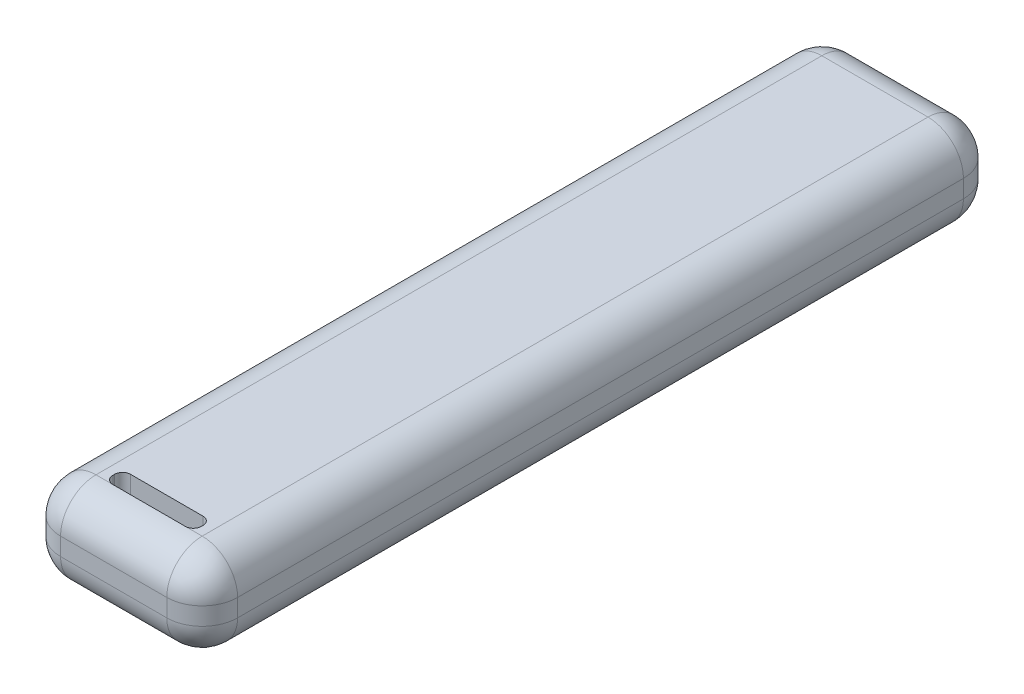
ISO-10303-21;
HEADER;
FILE_DESCRIPTION(('STEP AP214'),'2;1');
FILE_NAME('part.step','',(''),(''),'','','');
FILE_SCHEMA(('AUTOMOTIVE_DESIGN { 1 0 10303 214 1 1 1 1 }'));
ENDSEC;
DATA;
#1=APPLICATION_CONTEXT('core data for automotive mechanical design processes');
#2=APPLICATION_PROTOCOL_DEFINITION('international standard','automotive_design',2000,#1);
#3=PRODUCT_CONTEXT('',#1,'mechanical');
#4=PRODUCT('Part','Part','',(#3));
#5=PRODUCT_RELATED_PRODUCT_CATEGORY('part','',(#4));
#6=PRODUCT_DEFINITION_FORMATION('','',#4);
#7=PRODUCT_DEFINITION_CONTEXT('part definition',#1,'design');
#8=PRODUCT_DEFINITION('design','',#6,#7);
#9=PRODUCT_DEFINITION_SHAPE('','',#8);
#10=(LENGTH_UNIT() NAMED_UNIT(*) SI_UNIT(.MILLI.,.METRE.));
#11=(NAMED_UNIT(*) PLANE_ANGLE_UNIT() SI_UNIT($,.RADIAN.));
#12=(NAMED_UNIT(*) SI_UNIT($,.STERADIAN.) SOLID_ANGLE_UNIT());
#13=UNCERTAINTY_MEASURE_WITH_UNIT(LENGTH_MEASURE(1.E-05),#10,'distance_accuracy_value','');
#14=(GEOMETRIC_REPRESENTATION_CONTEXT(3) GLOBAL_UNCERTAINTY_ASSIGNED_CONTEXT((#13)) GLOBAL_UNIT_ASSIGNED_CONTEXT((#10,
#11,#12)) REPRESENTATION_CONTEXT('',''));
#15=CARTESIAN_POINT('',(0.,0.,0.));
#16=DIRECTION('',(0.,0.,1.));
#17=DIRECTION('',(1.,0.,0.));
#18=AXIS2_PLACEMENT_3D('',#15,#16,#17);
#19=CARTESIAN_POINT('',(5.,2.5,45.));
#20=DIRECTION('',(-1.,0.,0.));
#21=DIRECTION('',(0.,0.,1.));
#22=AXIS2_PLACEMENT_3D('',#19,#20,#21);
#23=PLANE('',#22);
#24=DIRECTION('',(0.,1.,0.));
#25=VECTOR('',#24,1.);
#26=CARTESIAN_POINT('',(5.,-2.5,43.));
#27=LINE('',#26,#25);
#28=CARTESIAN_POINT('',(5.,0.499999999999999,43.));
#29=VERTEX_POINT('',#28);
#30=CARTESIAN_POINT('',(5.,-0.499999999999999,43.));
#31=VERTEX_POINT('',#30);
#32=EDGE_CURVE('E244',#29,#31,#27,.F.);
#33=ORIENTED_EDGE('',*,*,#32,.T.);
#34=DIRECTION('',(0.,0.,-1.));
#35=VECTOR('',#34,1.);
#36=CARTESIAN_POINT('',(5.,-0.499999999999999,45.));
#37=LINE('',#36,#35);
#38=CARTESIAN_POINT('',(5.,-0.499999999999999,2.));
#39=VERTEX_POINT('',#38);
#40=EDGE_CURVE('E249',#31,#39,#37,.T.);
#41=ORIENTED_EDGE('',*,*,#40,.T.);
#42=DIRECTION('',(0.,1.,0.));
#43=VECTOR('',#42,1.);
#44=CARTESIAN_POINT('',(5.,2.5,2.));
#45=LINE('',#44,#43);
#46=CARTESIAN_POINT('',(5.,0.499999999999999,2.));
#47=VERTEX_POINT('',#46);
#48=EDGE_CURVE('E246',#39,#47,#45,.T.);
#49=ORIENTED_EDGE('',*,*,#48,.T.);
#50=DIRECTION('',(0.,0.,-1.));
#51=VECTOR('',#50,1.);
#52=CARTESIAN_POINT('',(5.,0.499999999999999,45.));
#53=LINE('',#52,#51);
#54=EDGE_CURVE('E242',#47,#29,#53,.F.);
#55=ORIENTED_EDGE('',*,*,#54,.T.);
#56=EDGE_LOOP('',(#33,#41,#49,#55));
#57=FACE_BOUND('',#56,.T.);
#58=ADVANCED_FACE('F32',(#57),#23,.F.);
#59=CARTESIAN_POINT('',(-5.,2.5,45.));
#60=DIRECTION('',(0.,-1.,0.));
#61=DIRECTION('',(0.,0.,-1.));
#62=AXIS2_PLACEMENT_3D('',#59,#60,#61);
#63=PLANE('',#62);
#64=DIRECTION('',(-1.,0.,0.));
#65=VECTOR('',#64,1.);
#66=CARTESIAN_POINT('',(5.,2.5,43.));
#67=LINE('',#66,#65);
#68=CARTESIAN_POINT('',(-3.,2.5,43.));
#69=VERTEX_POINT('',#68);
#70=CARTESIAN_POINT('',(-2.05,2.5,43.));
#71=VERTEX_POINT('',#70);
#72=EDGE_CURVE('E283',#69,#71,#67,.F.);
#73=ORIENTED_EDGE('',*,*,#72,.T.);
#74=CARTESIAN_POINT('',(-2.05,2.5,42.55));
#75=DIRECTION('',(0.,-1.,0.));
#76=DIRECTION('',(0.,0.,-1.));
#77=AXIS2_PLACEMENT_3D('',#74,#75,#76);
#78=CIRCLE('',#77,0.449999999999999);
#79=CARTESIAN_POINT('',(-2.5,2.5,42.55));
#80=VERTEX_POINT('',#79);
#81=EDGE_CURVE('E226',#71,#80,#78,.T.);
#82=ORIENTED_EDGE('',*,*,#81,.T.);
#83=DIRECTION('',(0.,0.,-1.));
#84=VECTOR('',#83,1.);
#85=CARTESIAN_POINT('',(-2.5,2.5,45.));
#86=LINE('',#85,#84);
#87=CARTESIAN_POINT('',(-2.5,2.5,42.45));
#88=VERTEX_POINT('',#87);
#89=EDGE_CURVE('E236',#80,#88,#86,.T.);
#90=ORIENTED_EDGE('',*,*,#89,.T.);
#91=CARTESIAN_POINT('',(-2.05,2.5,42.45));
#92=DIRECTION('',(0.,-1.,0.));
#93=DIRECTION('',(0.,0.,-1.));
#94=AXIS2_PLACEMENT_3D('',#91,#92,#93);
#95=CIRCLE('',#94,0.449999999999999);
#96=CARTESIAN_POINT('',(-2.05,2.5,42.));
#97=VERTEX_POINT('',#96);
#98=EDGE_CURVE('E239',#88,#97,#95,.T.);
#99=ORIENTED_EDGE('',*,*,#98,.T.);
#100=DIRECTION('',(1.,0.,0.));
#101=VECTOR('',#100,1.);
#102=CARTESIAN_POINT('',(-5.,2.5,42.));
#103=LINE('',#102,#101);
#104=CARTESIAN_POINT('',(2.05,2.5,42.));
#105=VERTEX_POINT('',#104);
#106=EDGE_CURVE('E180',#97,#105,#103,.T.);
#107=ORIENTED_EDGE('',*,*,#106,.T.);
#108=CARTESIAN_POINT('',(2.05,2.5,42.45));
#109=DIRECTION('',(0.,-1.,0.));
#110=DIRECTION('',(0.,0.,-1.));
#111=AXIS2_PLACEMENT_3D('',#108,#109,#110);
#112=CIRCLE('',#111,0.449999999999999);
#113=CARTESIAN_POINT('',(2.5,2.5,42.45));
#114=VERTEX_POINT('',#113);
#115=EDGE_CURVE('E230',#105,#114,#112,.T.);
#116=ORIENTED_EDGE('',*,*,#115,.T.);
#117=DIRECTION('',(0.,0.,1.));
#118=VECTOR('',#117,1.);
#119=CARTESIAN_POINT('',(2.5,2.5,45.));
#120=LINE('',#119,#118);
#121=CARTESIAN_POINT('',(2.5,2.5,42.55));
#122=VERTEX_POINT('',#121);
#123=EDGE_CURVE('E233',#114,#122,#120,.T.);
#124=ORIENTED_EDGE('',*,*,#123,.T.);
#125=CARTESIAN_POINT('',(2.05,2.5,42.55));
#126=DIRECTION('',(0.,-1.,0.));
#127=DIRECTION('',(0.,0.,-1.));
#128=AXIS2_PLACEMENT_3D('',#125,#126,#127);
#129=CIRCLE('',#128,0.449999999999999);
#130=CARTESIAN_POINT('',(2.05,2.5,43.));
#131=VERTEX_POINT('',#130);
#132=EDGE_CURVE('E213',#122,#131,#129,.T.);
#133=ORIENTED_EDGE('',*,*,#132,.T.);
#134=CARTESIAN_POINT('',(3.,2.5,43.));
#135=VERTEX_POINT('',#134);
#136=EDGE_CURVE('E282',#131,#135,#67,.F.);
#137=ORIENTED_EDGE('',*,*,#136,.T.);
#138=DIRECTION('',(0.,0.,-1.));
#139=VECTOR('',#138,1.);
#140=CARTESIAN_POINT('',(3.,2.5,45.));
#141=LINE('',#140,#139);
#142=CARTESIAN_POINT('',(3.,2.5,2.));
#143=VERTEX_POINT('',#142);
#144=EDGE_CURVE('E280',#135,#143,#141,.T.);
#145=ORIENTED_EDGE('',*,*,#144,.T.);
#146=DIRECTION('',(-1.,0.,0.));
#147=VECTOR('',#146,1.);
#148=CARTESIAN_POINT('',(-5.,2.5,2.));
#149=LINE('',#148,#147);
#150=CARTESIAN_POINT('',(-3.,2.5,2.));
#151=VERTEX_POINT('',#150);
#152=EDGE_CURVE('E286',#143,#151,#149,.T.);
#153=ORIENTED_EDGE('',*,*,#152,.T.);
#154=DIRECTION('',(0.,0.,-1.));
#155=VECTOR('',#154,1.);
#156=CARTESIAN_POINT('',(-3.,2.5,45.));
#157=LINE('',#156,#155);
#158=EDGE_CURVE('E290',#151,#69,#157,.F.);
#159=ORIENTED_EDGE('',*,*,#158,.T.);
#160=EDGE_LOOP('',(#73,#82,#90,#99,#107,#116,#124,#133,#137,#145,#153,#159));
#161=FACE_BOUND('',#160,.T.);
#162=ADVANCED_FACE('F443',(#161),#63,.F.);
#163=CARTESIAN_POINT('',(-5.,2.5,45.));
#164=DIRECTION('',(1.,0.,0.));
#165=DIRECTION('',(0.,0.,-1.));
#166=AXIS2_PLACEMENT_3D('',#163,#164,#165);
#167=PLANE('',#166);
#168=DIRECTION('',(0.,-1.,0.));
#169=VECTOR('',#168,1.);
#170=CARTESIAN_POINT('',(-5.,2.5,43.));
#171=LINE('',#170,#169);
#172=CARTESIAN_POINT('',(-5.,-0.499999999999999,43.));
#173=VERTEX_POINT('',#172);
#174=CARTESIAN_POINT('',(-5.,0.5,43.));
#175=VERTEX_POINT('',#174);
#176=EDGE_CURVE('E273',#173,#175,#171,.F.);
#177=ORIENTED_EDGE('',*,*,#176,.T.);
#178=DIRECTION('',(0.,0.,-1.));
#179=VECTOR('',#178,1.);
#180=CARTESIAN_POINT('',(-5.,0.5,45.));
#181=LINE('',#180,#179);
#182=CARTESIAN_POINT('',(-5.,0.5,2.));
#183=VERTEX_POINT('',#182);
#184=EDGE_CURVE('E278',#175,#183,#181,.T.);
#185=ORIENTED_EDGE('',*,*,#184,.T.);
#186=DIRECTION('',(0.,-1.,0.));
#187=VECTOR('',#186,1.);
#188=CARTESIAN_POINT('',(-5.,2.5,2.));
#189=LINE('',#188,#187);
#190=CARTESIAN_POINT('',(-5.,-0.499999999999999,2.));
#191=VERTEX_POINT('',#190);
#192=EDGE_CURVE('E275',#183,#191,#189,.T.);
#193=ORIENTED_EDGE('',*,*,#192,.T.);
#194=DIRECTION('',(0.,0.,-1.));
#195=VECTOR('',#194,1.);
#196=CARTESIAN_POINT('',(-5.,-0.499999999999999,45.));
#197=LINE('',#196,#195);
#198=EDGE_CURVE('E271',#191,#173,#197,.F.);
#199=ORIENTED_EDGE('',*,*,#198,.T.);
#200=EDGE_LOOP('',(#177,#185,#193,#199));
#201=FACE_BOUND('',#200,.T.);
#202=ADVANCED_FACE('F413',(#201),#167,.F.);
#203=CARTESIAN_POINT('',(-5.,-2.5,45.));
#204=DIRECTION('',(0.,1.,0.));
#205=DIRECTION('',(0.,0.,1.));
#206=AXIS2_PLACEMENT_3D('',#203,#204,#205);
#207=PLANE('',#206);
#208=DIRECTION('',(0.,0.,-1.));
#209=VECTOR('',#208,1.);
#210=CARTESIAN_POINT('',(-2.5,-2.5,42.45));
#211=LINE('',#210,#209);
#212=CARTESIAN_POINT('',(-2.5,-2.5,42.55));
#213=VERTEX_POINT('',#212);
#214=CARTESIAN_POINT('',(-2.5,-2.5,42.45));
#215=VERTEX_POINT('',#214);
#216=EDGE_CURVE('E184',#213,#215,#211,.T.);
#217=ORIENTED_EDGE('',*,*,#216,.F.);
#218=CARTESIAN_POINT('',(-2.05,-2.5,42.55));
#219=DIRECTION('',(0.,-1.,0.));
#220=DIRECTION('',(0.,0.,-1.));
#221=AXIS2_PLACEMENT_3D('',#218,#219,#220);
#222=CIRCLE('',#221,0.449999999999999);
#223=CARTESIAN_POINT('',(-2.05,-2.5,43.));
#224=VERTEX_POINT('',#223);
#225=EDGE_CURVE('E208',#224,#213,#222,.T.);
#226=ORIENTED_EDGE('',*,*,#225,.F.);
#227=DIRECTION('',(1.,0.,0.));
#228=VECTOR('',#227,1.);
#229=CARTESIAN_POINT('',(-5.,-2.5,43.));
#230=LINE('',#229,#228);
#231=CARTESIAN_POINT('',(-3.,-2.5,43.));
#232=VERTEX_POINT('',#231);
#233=EDGE_CURVE('E262',#224,#232,#230,.F.);
#234=ORIENTED_EDGE('',*,*,#233,.T.);
#235=DIRECTION('',(0.,0.,-1.));
#236=VECTOR('',#235,1.);
#237=CARTESIAN_POINT('',(-3.,-2.5,45.));
#238=LINE('',#237,#236);
#239=CARTESIAN_POINT('',(-3.,-2.5,2.));
#240=VERTEX_POINT('',#239);
#241=EDGE_CURVE('E269',#232,#240,#238,.T.);
#242=ORIENTED_EDGE('',*,*,#241,.T.);
#243=DIRECTION('',(1.,0.,0.));
#244=VECTOR('',#243,1.);
#245=CARTESIAN_POINT('',(-5.,-2.5,2.));
#246=LINE('',#245,#244);
#247=CARTESIAN_POINT('',(3.,-2.5,2.));
#248=VERTEX_POINT('',#247);
#249=EDGE_CURVE('E266',#240,#248,#246,.T.);
#250=ORIENTED_EDGE('',*,*,#249,.T.);
#251=DIRECTION('',(0.,0.,-1.));
#252=VECTOR('',#251,1.);
#253=CARTESIAN_POINT('',(3.,-2.5,45.));
#254=LINE('',#253,#252);
#255=CARTESIAN_POINT('',(3.,-2.5,43.));
#256=VERTEX_POINT('',#255);
#257=EDGE_CURVE('E260',#248,#256,#254,.F.);
#258=ORIENTED_EDGE('',*,*,#257,.T.);
#259=CARTESIAN_POINT('',(2.05,-2.5,43.));
#260=VERTEX_POINT('',#259);
#261=EDGE_CURVE('E263',#256,#260,#230,.F.);
#262=ORIENTED_EDGE('',*,*,#261,.T.);
#263=CARTESIAN_POINT('',(2.05,-2.5,42.55));
#264=DIRECTION('',(0.,-1.,0.));
#265=DIRECTION('',(0.,0.,-1.));
#266=AXIS2_PLACEMENT_3D('',#263,#264,#265);
#267=CIRCLE('',#266,0.449999999999999);
#268=CARTESIAN_POINT('',(2.5,-2.5,42.55));
#269=VERTEX_POINT('',#268);
#270=EDGE_CURVE('E49',#269,#260,#267,.T.);
#271=ORIENTED_EDGE('',*,*,#270,.F.);
#272=DIRECTION('',(0.,0.,1.));
#273=VECTOR('',#272,1.);
#274=CARTESIAN_POINT('',(2.5,-2.5,42.45));
#275=LINE('',#274,#273);
#276=CARTESIAN_POINT('',(2.5,-2.5,42.45));
#277=VERTEX_POINT('',#276);
#278=EDGE_CURVE('E200',#277,#269,#275,.T.);
#279=ORIENTED_EDGE('',*,*,#278,.F.);
#280=CARTESIAN_POINT('',(2.05,-2.5,42.45));
#281=DIRECTION('',(0.,-1.,0.));
#282=DIRECTION('',(0.,0.,-1.));
#283=AXIS2_PLACEMENT_3D('',#280,#281,#282);
#284=CIRCLE('',#283,0.449999999999999);
#285=CARTESIAN_POINT('',(2.05,-2.5,42.));
#286=VERTEX_POINT('',#285);
#287=EDGE_CURVE('E198',#286,#277,#284,.T.);
#288=ORIENTED_EDGE('',*,*,#287,.F.);
#289=DIRECTION('',(1.,0.,0.));
#290=VECTOR('',#289,1.);
#291=CARTESIAN_POINT('',(2.05,-2.5,42.));
#292=LINE('',#291,#290);
#293=CARTESIAN_POINT('',(-2.05,-2.5,42.));
#294=VERTEX_POINT('',#293);
#295=EDGE_CURVE('E177',#294,#286,#292,.T.);
#296=ORIENTED_EDGE('',*,*,#295,.F.);
#297=CARTESIAN_POINT('',(-2.05,-2.5,42.45));
#298=DIRECTION('',(0.,-1.,0.));
#299=DIRECTION('',(0.,0.,1.));
#300=AXIS2_PLACEMENT_3D('',#297,#298,#299);
#301=CIRCLE('',#300,0.449999999999999);
#302=EDGE_CURVE('E187',#215,#294,#301,.T.);
#303=ORIENTED_EDGE('',*,*,#302,.F.);
#304=EDGE_LOOP('',(#217,#226,#234,#242,#250,#258,#262,#271,#279,#288,#296,#303));
#305=FACE_BOUND('',#304,.T.);
#306=ADVANCED_FACE('F195',(#305),#207,.F.);
#307=CARTESIAN_POINT('',(5.,-2.5,45.));
#308=DIRECTION('',(0.,0.,1.));
#309=DIRECTION('',(1.,0.,0.));
#310=AXIS2_PLACEMENT_3D('',#307,#308,#309);
#311=PLANE('',#310);
#312=DIRECTION('',(0.,1.,0.));
#313=VECTOR('',#312,1.);
#314=CARTESIAN_POINT('',(3.,2.5,45.));
#315=LINE('',#314,#313);
#316=CARTESIAN_POINT('',(3.,-0.499999999999999,45.));
#317=VERTEX_POINT('',#316);
#318=CARTESIAN_POINT('',(3.,0.499999999999999,45.));
#319=VERTEX_POINT('',#318);
#320=EDGE_CURVE('E41',#317,#319,#315,.T.);
#321=ORIENTED_EDGE('',*,*,#320,.T.);
#322=DIRECTION('',(-1.,0.,0.));
#323=VECTOR('',#322,1.);
#324=CARTESIAN_POINT('',(-5.,0.499999999999999,45.));
#325=LINE('',#324,#323);
#326=CARTESIAN_POINT('',(-3.,0.499999999999999,45.));
#327=VERTEX_POINT('',#326);
#328=EDGE_CURVE('E12',#319,#327,#325,.T.);
#329=ORIENTED_EDGE('',*,*,#328,.T.);
#330=DIRECTION('',(0.,-1.,0.));
#331=VECTOR('',#330,1.);
#332=CARTESIAN_POINT('',(-3.,-2.5,45.));
#333=LINE('',#332,#331);
#334=CARTESIAN_POINT('',(-3.,-0.499999999999999,45.));
#335=VERTEX_POINT('',#334);
#336=EDGE_CURVE('E292',#327,#335,#333,.T.);
#337=ORIENTED_EDGE('',*,*,#336,.T.);
#338=DIRECTION('',(1.,0.,0.));
#339=VECTOR('',#338,1.);
#340=CARTESIAN_POINT('',(5.,-0.499999999999999,45.));
#341=LINE('',#340,#339);
#342=EDGE_CURVE('E294',#335,#317,#341,.T.);
#343=ORIENTED_EDGE('',*,*,#342,.T.);
#344=EDGE_LOOP('',(#321,#329,#337,#343));
#345=FACE_BOUND('',#344,.T.);
#346=ADVANCED_FACE('F387',(#345),#311,.T.);
#347=CARTESIAN_POINT('',(5.,-2.5,0.));
#348=DIRECTION('',(0.,0.,1.));
#349=DIRECTION('',(1.,0.,0.));
#350=AXIS2_PLACEMENT_3D('',#347,#348,#349);
#351=PLANE('',#350);
#352=DIRECTION('',(-1.,0.,0.));
#353=VECTOR('',#352,1.);
#354=CARTESIAN_POINT('',(5.,0.499999999999999,0.));
#355=LINE('',#354,#353);
#356=CARTESIAN_POINT('',(-3.,0.499999999999999,0.));
#357=VERTEX_POINT('',#356);
#358=CARTESIAN_POINT('',(3.,0.499999999999999,0.));
#359=VERTEX_POINT('',#358);
#360=EDGE_CURVE('E251',#357,#359,#355,.F.);
#361=ORIENTED_EDGE('',*,*,#360,.T.);
#362=DIRECTION('',(0.,1.,0.));
#363=VECTOR('',#362,1.);
#364=CARTESIAN_POINT('',(3.,-2.5,0.));
#365=LINE('',#364,#363);
#366=CARTESIAN_POINT('',(3.,-0.499999999999999,0.));
#367=VERTEX_POINT('',#366);
#368=EDGE_CURVE('E257',#359,#367,#365,.F.);
#369=ORIENTED_EDGE('',*,*,#368,.T.);
#370=DIRECTION('',(1.,0.,0.));
#371=VECTOR('',#370,1.);
#372=CARTESIAN_POINT('',(5.,-0.499999999999999,0.));
#373=LINE('',#372,#371);
#374=CARTESIAN_POINT('',(-3.,-0.499999999999999,0.));
#375=VERTEX_POINT('',#374);
#376=EDGE_CURVE('E255',#367,#375,#373,.F.);
#377=ORIENTED_EDGE('',*,*,#376,.T.);
#378=DIRECTION('',(0.,-1.,0.));
#379=VECTOR('',#378,1.);
#380=CARTESIAN_POINT('',(-3.,-2.5,0.));
#381=LINE('',#380,#379);
#382=EDGE_CURVE('E253',#375,#357,#381,.F.);
#383=ORIENTED_EDGE('',*,*,#382,.T.);
#384=EDGE_LOOP('',(#361,#369,#377,#383));
#385=FACE_BOUND('',#384,.T.);
#386=ADVANCED_FACE('F525',(#385),#351,.F.);
#387=CARTESIAN_POINT('',(-3.,-2.5,43.));
#388=DIRECTION('',(0.,1.,0.));
#389=DIRECTION('',(0.,0.,1.));
#390=AXIS2_PLACEMENT_3D('',#387,#388,#389);
#391=CYLINDRICAL_SURFACE('',#390,2.);
#392=CARTESIAN_POINT('',(-3.,-0.499999999999999,43.));
#393=DIRECTION('',(0.,-1.,0.));
#394=DIRECTION('',(0.,0.,-1.));
#395=AXIS2_PLACEMENT_3D('',#392,#393,#394);
#396=CIRCLE('',#395,2.);
#397=EDGE_CURVE('E36',#335,#173,#396,.T.);
#398=ORIENTED_EDGE('',*,*,#397,.F.);
#399=ORIENTED_EDGE('',*,*,#336,.F.);
#400=CARTESIAN_POINT('',(-3.,0.5,43.));
#401=DIRECTION('',(0.,1.,0.));
#402=DIRECTION('',(0.,0.,1.));
#403=AXIS2_PLACEMENT_3D('',#400,#401,#402);
#404=CIRCLE('',#403,2.);
#405=EDGE_CURVE('E355',#175,#327,#404,.T.);
#406=ORIENTED_EDGE('',*,*,#405,.F.);
#407=ORIENTED_EDGE('',*,*,#176,.F.);
#408=EDGE_LOOP('',(#398,#399,#406,#407));
#409=FACE_BOUND('',#408,.T.);
#410=ADVANCED_FACE('F34',(#409),#391,.T.);
#411=CARTESIAN_POINT('',(-3.,-0.499999999999999,43.));
#412=DIRECTION('',(0.,0.,1.));
#413=DIRECTION('',(1.,0.,0.));
#414=AXIS2_PLACEMENT_3D('',#411,#412,#413);
#415=SPHERICAL_SURFACE('',#414,2.);
#416=CARTESIAN_POINT('',(-3.,-0.499999999999999,43.));
#417=DIRECTION('',(-1.,0.,0.));
#418=DIRECTION('',(0.,0.,1.));
#419=AXIS2_PLACEMENT_3D('',#416,#417,#418);
#420=CIRCLE('',#419,2.);
#421=EDGE_CURVE('E350',#335,#232,#420,.F.);
#422=ORIENTED_EDGE('',*,*,#421,.F.);
#423=ORIENTED_EDGE('',*,*,#397,.T.);
#424=CARTESIAN_POINT('',(-3.,-0.499999999999999,43.));
#425=DIRECTION('',(0.,0.,1.));
#426=DIRECTION('',(1.,0.,0.));
#427=AXIS2_PLACEMENT_3D('',#424,#425,#426);
#428=CIRCLE('',#427,2.);
#429=EDGE_CURVE('E353',#232,#173,#428,.F.);
#430=ORIENTED_EDGE('',*,*,#429,.F.);
#431=EDGE_LOOP('',(#422,#423,#430));
#432=FACE_BOUND('',#431,.T.);
#433=ADVANCED_FACE('F367',(#432),#415,.T.);
#434=CARTESIAN_POINT('',(-3.,0.499999999999999,43.));
#435=DIRECTION('',(0.,0.,1.));
#436=DIRECTION('',(1.,0.,0.));
#437=AXIS2_PLACEMENT_3D('',#434,#435,#436);
#438=SPHERICAL_SURFACE('',#437,2.);
#439=CARTESIAN_POINT('',(-3.,0.499999999999999,43.));
#440=DIRECTION('',(0.,0.,1.));
#441=DIRECTION('',(1.,0.,0.));
#442=AXIS2_PLACEMENT_3D('',#439,#440,#441);
#443=CIRCLE('',#442,2.);
#444=EDGE_CURVE('E345',#175,#69,#443,.F.);
#445=ORIENTED_EDGE('',*,*,#444,.F.);
#446=ORIENTED_EDGE('',*,*,#405,.T.);
#447=CARTESIAN_POINT('',(-3.,0.499999999999999,43.));
#448=DIRECTION('',(-1.,0.,0.));
#449=DIRECTION('',(0.,-1.,0.));
#450=AXIS2_PLACEMENT_3D('',#447,#448,#449);
#451=CIRCLE('',#450,2.);
#452=EDGE_CURVE('E348',#69,#327,#451,.F.);
#453=ORIENTED_EDGE('',*,*,#452,.F.);
#454=EDGE_LOOP('',(#445,#446,#453));
#455=FACE_BOUND('',#454,.T.);
#456=ADVANCED_FACE('F405',(#455),#438,.T.);
#457=CARTESIAN_POINT('',(-3.,-0.499999999999999,45.));
#458=DIRECTION('',(0.,0.,-1.));
#459=DIRECTION('',(-1.,0.,0.));
#460=AXIS2_PLACEMENT_3D('',#457,#458,#459);
#461=CYLINDRICAL_SURFACE('',#460,2.);
#462=ORIENTED_EDGE('',*,*,#429,.T.);
#463=ORIENTED_EDGE('',*,*,#198,.F.);
#464=CARTESIAN_POINT('',(-3.,-0.499999999999999,2.));
#465=DIRECTION('',(0.,0.,-1.));
#466=DIRECTION('',(-1.,0.,0.));
#467=AXIS2_PLACEMENT_3D('',#464,#465,#466);
#468=CIRCLE('',#467,2.);
#469=EDGE_CURVE('E340',#240,#191,#468,.T.);
#470=ORIENTED_EDGE('',*,*,#469,.F.);
#471=ORIENTED_EDGE('',*,*,#241,.F.);
#472=EDGE_LOOP('',(#462,#463,#470,#471));
#473=FACE_BOUND('',#472,.T.);
#474=ADVANCED_FACE('F374',(#473),#461,.T.);
#475=CARTESIAN_POINT('',(5.,-0.499999999999999,43.));
#476=DIRECTION('',(-1.,0.,0.));
#477=DIRECTION('',(0.,0.,1.));
#478=AXIS2_PLACEMENT_3D('',#475,#476,#477);
#479=CYLINDRICAL_SURFACE('',#478,2.);
#480=ORIENTED_EDGE('',*,*,#421,.T.);
#481=ORIENTED_EDGE('',*,*,#233,.F.);
#482=DIRECTION('',(-1.,0.,0.));
#483=VECTOR('',#482,1.);
#484=CARTESIAN_POINT('',(2.05,-2.5,43.));
#485=LINE('',#484,#483);
#486=EDGE_CURVE('E206',#260,#224,#485,.T.);
#487=ORIENTED_EDGE('',*,*,#486,.F.);
#488=ORIENTED_EDGE('',*,*,#261,.F.);
#489=CARTESIAN_POINT('',(3.,-0.499999999999999,43.));
#490=DIRECTION('',(1.,0.,0.));
#491=DIRECTION('',(0.,0.,-1.));
#492=AXIS2_PLACEMENT_3D('',#489,#490,#491);
#493=CIRCLE('',#492,2.);
#494=EDGE_CURVE('E337',#317,#256,#493,.T.);
#495=ORIENTED_EDGE('',*,*,#494,.F.);
#496=ORIENTED_EDGE('',*,*,#342,.F.);
#497=EDGE_LOOP('',(#480,#481,#487,#488,#495,#496));
#498=FACE_BOUND('',#497,.T.);
#499=ADVANCED_FACE('F382',(#498),#479,.T.);
#500=CARTESIAN_POINT('',(3.,-2.5,43.));
#501=DIRECTION('',(0.,-1.,0.));
#502=DIRECTION('',(0.,0.,-1.));
#503=AXIS2_PLACEMENT_3D('',#500,#501,#502);
#504=CYLINDRICAL_SURFACE('',#503,2.);
#505=CARTESIAN_POINT('',(3.,0.499999999999999,43.));
#506=DIRECTION('',(0.,1.,0.));
#507=DIRECTION('',(0.,0.,1.));
#508=AXIS2_PLACEMENT_3D('',#505,#506,#507);
#509=CIRCLE('',#508,2.);
#510=EDGE_CURVE('E331',#319,#29,#509,.T.);
#511=ORIENTED_EDGE('',*,*,#510,.F.);
#512=ORIENTED_EDGE('',*,*,#320,.F.);
#513=CARTESIAN_POINT('',(3.,-0.499999999999999,43.));
#514=DIRECTION('',(0.,-1.,0.));
#515=DIRECTION('',(0.,0.,-1.));
#516=AXIS2_PLACEMENT_3D('',#513,#514,#515);
#517=CIRCLE('',#516,2.);
#518=EDGE_CURVE('E334',#31,#317,#517,.T.);
#519=ORIENTED_EDGE('',*,*,#518,.F.);
#520=ORIENTED_EDGE('',*,*,#32,.F.);
#521=EDGE_LOOP('',(#511,#512,#519,#520));
#522=FACE_BOUND('',#521,.T.);
#523=ADVANCED_FACE('F392',(#522),#504,.T.);
#524=CARTESIAN_POINT('',(5.,0.499999999999999,43.));
#525=DIRECTION('',(1.,0.,0.));
#526=DIRECTION('',(0.,0.,-1.));
#527=AXIS2_PLACEMENT_3D('',#524,#525,#526);
#528=CYLINDRICAL_SURFACE('',#527,2.);
#529=ORIENTED_EDGE('',*,*,#452,.T.);
#530=ORIENTED_EDGE('',*,*,#328,.F.);
#531=CARTESIAN_POINT('',(3.,0.499999999999999,43.));
#532=DIRECTION('',(1.,0.,0.));
#533=DIRECTION('',(0.,0.,-1.));
#534=AXIS2_PLACEMENT_3D('',#531,#532,#533);
#535=CIRCLE('',#534,2.);
#536=EDGE_CURVE('E328',#135,#319,#535,.T.);
#537=ORIENTED_EDGE('',*,*,#536,.F.);
#538=ORIENTED_EDGE('',*,*,#136,.F.);
#539=EDGE_CURVE('E287',#71,#131,#67,.F.);
#540=ORIENTED_EDGE('',*,*,#539,.F.);
#541=ORIENTED_EDGE('',*,*,#72,.F.);
#542=EDGE_LOOP('',(#529,#530,#537,#538,#540,#541));
#543=FACE_BOUND('',#542,.T.);
#544=ADVANCED_FACE('F402',(#543),#528,.T.);
#545=CARTESIAN_POINT('',(-3.,0.5,45.));
#546=DIRECTION('',(0.,0.,-1.));
#547=DIRECTION('',(-1.,0.,0.));
#548=AXIS2_PLACEMENT_3D('',#545,#546,#547);
#549=CYLINDRICAL_SURFACE('',#548,2.);
#550=ORIENTED_EDGE('',*,*,#444,.T.);
#551=ORIENTED_EDGE('',*,*,#158,.F.);
#552=CARTESIAN_POINT('',(-3.,0.5,2.));
#553=DIRECTION('',(0.,0.,-1.));
#554=DIRECTION('',(-1.,0.,0.));
#555=AXIS2_PLACEMENT_3D('',#552,#553,#554);
#556=CIRCLE('',#555,2.);
#557=EDGE_CURVE('E325',#183,#151,#556,.T.);
#558=ORIENTED_EDGE('',*,*,#557,.F.);
#559=ORIENTED_EDGE('',*,*,#184,.F.);
#560=EDGE_LOOP('',(#550,#551,#558,#559));
#561=FACE_BOUND('',#560,.T.);
#562=ADVANCED_FACE('F410',(#561),#549,.T.);
#563=CARTESIAN_POINT('',(-3.,2.5,2.));
#564=DIRECTION('',(0.,-1.,0.));
#565=DIRECTION('',(0.,0.,-1.));
#566=AXIS2_PLACEMENT_3D('',#563,#564,#565);
#567=CYLINDRICAL_SURFACE('',#566,2.);
#568=CARTESIAN_POINT('',(-3.,-0.499999999999999,2.));
#569=DIRECTION('',(0.,-1.,0.));
#570=DIRECTION('',(0.,0.,-1.));
#571=AXIS2_PLACEMENT_3D('',#568,#569,#570);
#572=CIRCLE('',#571,2.);
#573=EDGE_CURVE('E342',#191,#375,#572,.T.);
#574=ORIENTED_EDGE('',*,*,#573,.F.);
#575=ORIENTED_EDGE('',*,*,#192,.F.);
#576=CARTESIAN_POINT('',(-3.,0.499999999999999,2.));
#577=DIRECTION('',(0.,1.,0.));
#578=DIRECTION('',(-1.,0.,0.));
#579=AXIS2_PLACEMENT_3D('',#576,#577,#578);
#580=CIRCLE('',#579,2.);
#581=EDGE_CURVE('E322',#357,#183,#580,.T.);
#582=ORIENTED_EDGE('',*,*,#581,.F.);
#583=ORIENTED_EDGE('',*,*,#382,.F.);
#584=EDGE_LOOP('',(#574,#575,#582,#583));
#585=FACE_BOUND('',#584,.T.);
#586=ADVANCED_FACE('F417',(#585),#567,.T.);
#587=CARTESIAN_POINT('',(-3.,-0.499999999999999,2.));
#588=DIRECTION('',(0.,0.,1.));
#589=DIRECTION('',(1.,0.,0.));
#590=AXIS2_PLACEMENT_3D('',#587,#588,#589);
#591=SPHERICAL_SURFACE('',#590,2.);
#592=ORIENTED_EDGE('',*,*,#469,.T.);
#593=ORIENTED_EDGE('',*,*,#573,.T.);
#594=CARTESIAN_POINT('',(-3.,-0.499999999999999,2.));
#595=DIRECTION('',(-1.,0.,0.));
#596=DIRECTION('',(0.,-1.,0.));
#597=AXIS2_PLACEMENT_3D('',#594,#595,#596);
#598=CIRCLE('',#597,2.);
#599=EDGE_CURVE('E319',#240,#375,#598,.F.);
#600=ORIENTED_EDGE('',*,*,#599,.F.);
#601=EDGE_LOOP('',(#592,#593,#600));
#602=FACE_BOUND('',#601,.T.);
#603=ADVANCED_FACE('F421',(#602),#591,.T.);
#604=CARTESIAN_POINT('',(3.,-0.499999999999999,43.));
#605=DIRECTION('',(0.,0.,1.));
#606=DIRECTION('',(1.,0.,0.));
#607=AXIS2_PLACEMENT_3D('',#604,#605,#606);
#608=SPHERICAL_SURFACE('',#607,2.);
#609=ORIENTED_EDGE('',*,*,#518,.T.);
#610=ORIENTED_EDGE('',*,*,#494,.T.);
#611=CARTESIAN_POINT('',(3.,-0.499999999999999,43.));
#612=DIRECTION('',(0.,0.,1.));
#613=DIRECTION('',(1.,0.,0.));
#614=AXIS2_PLACEMENT_3D('',#611,#612,#613);
#615=CIRCLE('',#614,2.);
#616=EDGE_CURVE('E316',#31,#256,#615,.F.);
#617=ORIENTED_EDGE('',*,*,#616,.F.);
#618=EDGE_LOOP('',(#609,#610,#617));
#619=FACE_BOUND('',#618,.T.);
#620=ADVANCED_FACE('F434',(#619),#608,.T.);
#621=CARTESIAN_POINT('',(3.,0.499999999999999,43.));
#622=DIRECTION('',(0.,0.,1.));
#623=DIRECTION('',(1.,0.,0.));
#624=AXIS2_PLACEMENT_3D('',#621,#622,#623);
#625=SPHERICAL_SURFACE('',#624,2.);
#626=ORIENTED_EDGE('',*,*,#536,.T.);
#627=ORIENTED_EDGE('',*,*,#510,.T.);
#628=CARTESIAN_POINT('',(3.,0.499999999999999,43.));
#629=DIRECTION('',(0.,0.,1.));
#630=DIRECTION('',(1.,0.,0.));
#631=AXIS2_PLACEMENT_3D('',#628,#629,#630);
#632=CIRCLE('',#631,2.);
#633=EDGE_CURVE('E313',#135,#29,#632,.F.);
#634=ORIENTED_EDGE('',*,*,#633,.F.);
#635=EDGE_LOOP('',(#626,#627,#634));
#636=FACE_BOUND('',#635,.T.);
#637=ADVANCED_FACE('F398',(#636),#625,.T.);
#638=CARTESIAN_POINT('',(-3.,0.499999999999999,2.));
#639=DIRECTION('',(0.,0.,1.));
#640=DIRECTION('',(1.,0.,0.));
#641=AXIS2_PLACEMENT_3D('',#638,#639,#640);
#642=SPHERICAL_SURFACE('',#641,2.);
#643=ORIENTED_EDGE('',*,*,#581,.T.);
#644=ORIENTED_EDGE('',*,*,#557,.T.);
#645=CARTESIAN_POINT('',(-3.,0.499999999999999,2.));
#646=DIRECTION('',(-1.,0.,0.));
#647=DIRECTION('',(0.,0.,1.));
#648=AXIS2_PLACEMENT_3D('',#645,#646,#647);
#649=CIRCLE('',#648,2.);
#650=EDGE_CURVE('E311',#357,#151,#649,.F.);
#651=ORIENTED_EDGE('',*,*,#650,.F.);
#652=EDGE_LOOP('',(#643,#644,#651));
#653=FACE_BOUND('',#652,.T.);
#654=ADVANCED_FACE('F450',(#653),#642,.T.);
#655=CARTESIAN_POINT('',(-5.,-0.499999999999999,2.));
#656=DIRECTION('',(1.,0.,0.));
#657=DIRECTION('',(0.,0.,-1.));
#658=AXIS2_PLACEMENT_3D('',#655,#656,#657);
#659=CYLINDRICAL_SURFACE('',#658,2.);
#660=ORIENTED_EDGE('',*,*,#599,.T.);
#661=ORIENTED_EDGE('',*,*,#376,.F.);
#662=CARTESIAN_POINT('',(3.,-0.499999999999999,2.));
#663=DIRECTION('',(1.,0.,0.));
#664=DIRECTION('',(0.,0.,-1.));
#665=AXIS2_PLACEMENT_3D('',#662,#663,#664);
#666=CIRCLE('',#665,2.);
#667=EDGE_CURVE('E308',#248,#367,#666,.T.);
#668=ORIENTED_EDGE('',*,*,#667,.F.);
#669=ORIENTED_EDGE('',*,*,#249,.F.);
#670=EDGE_LOOP('',(#660,#661,#668,#669));
#671=FACE_BOUND('',#670,.T.);
#672=ADVANCED_FACE('F424',(#671),#659,.T.);
#673=CARTESIAN_POINT('',(3.,-0.499999999999999,45.));
#674=DIRECTION('',(0.,0.,-1.));
#675=DIRECTION('',(-1.,0.,0.));
#676=AXIS2_PLACEMENT_3D('',#673,#674,#675);
#677=CYLINDRICAL_SURFACE('',#676,2.);
#678=ORIENTED_EDGE('',*,*,#616,.T.);
#679=ORIENTED_EDGE('',*,*,#257,.F.);
#680=CARTESIAN_POINT('',(3.,-0.499999999999999,2.));
#681=DIRECTION('',(0.,0.,-1.));
#682=DIRECTION('',(-1.,0.,0.));
#683=AXIS2_PLACEMENT_3D('',#680,#681,#682);
#684=CIRCLE('',#683,2.);
#685=EDGE_CURVE('E306',#39,#248,#684,.T.);
#686=ORIENTED_EDGE('',*,*,#685,.F.);
#687=ORIENTED_EDGE('',*,*,#40,.F.);
#688=EDGE_LOOP('',(#678,#679,#686,#687));
#689=FACE_BOUND('',#688,.T.);
#690=ADVANCED_FACE('F431',(#689),#677,.T.);
#691=CARTESIAN_POINT('',(3.,0.499999999999999,45.));
#692=DIRECTION('',(0.,0.,-1.));
#693=DIRECTION('',(-1.,0.,0.));
#694=AXIS2_PLACEMENT_3D('',#691,#692,#693);
#695=CYLINDRICAL_SURFACE('',#694,2.);
#696=ORIENTED_EDGE('',*,*,#633,.T.);
#697=ORIENTED_EDGE('',*,*,#54,.F.);
#698=CARTESIAN_POINT('',(3.,0.499999999999999,2.));
#699=DIRECTION('',(0.,0.,-1.));
#700=DIRECTION('',(-1.,0.,0.));
#701=AXIS2_PLACEMENT_3D('',#698,#699,#700);
#702=CIRCLE('',#701,2.);
#703=EDGE_CURVE('E303',#143,#47,#702,.T.);
#704=ORIENTED_EDGE('',*,*,#703,.F.);
#705=ORIENTED_EDGE('',*,*,#144,.F.);
#706=EDGE_LOOP('',(#696,#697,#704,#705));
#707=FACE_BOUND('',#706,.T.);
#708=ADVANCED_FACE('F440',(#707),#695,.T.);
#709=CARTESIAN_POINT('',(-5.,0.499999999999999,2.));
#710=DIRECTION('',(-1.,0.,0.));
#711=DIRECTION('',(0.,0.,1.));
#712=AXIS2_PLACEMENT_3D('',#709,#710,#711);
#713=CYLINDRICAL_SURFACE('',#712,2.);
#714=ORIENTED_EDGE('',*,*,#650,.T.);
#715=ORIENTED_EDGE('',*,*,#152,.F.);
#716=CARTESIAN_POINT('',(3.,0.499999999999999,2.));
#717=DIRECTION('',(1.,0.,0.));
#718=DIRECTION('',(0.,1.,0.));
#719=AXIS2_PLACEMENT_3D('',#716,#717,#718);
#720=CIRCLE('',#719,2.);
#721=EDGE_CURVE('E300',#359,#143,#720,.T.);
#722=ORIENTED_EDGE('',*,*,#721,.F.);
#723=ORIENTED_EDGE('',*,*,#360,.F.);
#724=EDGE_LOOP('',(#714,#715,#722,#723));
#725=FACE_BOUND('',#724,.T.);
#726=ADVANCED_FACE('F446',(#725),#713,.T.);
#727=CARTESIAN_POINT('',(3.,-0.499999999999999,2.));
#728=DIRECTION('',(0.,0.,1.));
#729=DIRECTION('',(1.,0.,0.));
#730=AXIS2_PLACEMENT_3D('',#727,#728,#729);
#731=SPHERICAL_SURFACE('',#730,2.);
#732=ORIENTED_EDGE('',*,*,#685,.T.);
#733=ORIENTED_EDGE('',*,*,#667,.T.);
#734=CARTESIAN_POINT('',(3.,-0.499999999999999,2.));
#735=DIRECTION('',(0.,-1.,0.));
#736=DIRECTION('',(0.,0.,-1.));
#737=AXIS2_PLACEMENT_3D('',#734,#735,#736);
#738=CIRCLE('',#737,2.);
#739=EDGE_CURVE('E298',#39,#367,#738,.F.);
#740=ORIENTED_EDGE('',*,*,#739,.F.);
#741=EDGE_LOOP('',(#732,#733,#740));
#742=FACE_BOUND('',#741,.T.);
#743=ADVANCED_FACE('F488',(#742),#731,.T.);
#744=CARTESIAN_POINT('',(3.,0.499999999999999,2.));
#745=DIRECTION('',(0.,0.,1.));
#746=DIRECTION('',(1.,0.,0.));
#747=AXIS2_PLACEMENT_3D('',#744,#745,#746);
#748=SPHERICAL_SURFACE('',#747,2.);
#749=ORIENTED_EDGE('',*,*,#721,.T.);
#750=ORIENTED_EDGE('',*,*,#703,.T.);
#751=CARTESIAN_POINT('',(3.,0.499999999999999,2.));
#752=DIRECTION('',(0.,1.,0.));
#753=DIRECTION('',(0.,0.,1.));
#754=AXIS2_PLACEMENT_3D('',#751,#752,#753);
#755=CIRCLE('',#754,2.);
#756=EDGE_CURVE('E241',#359,#47,#755,.F.);
#757=ORIENTED_EDGE('',*,*,#756,.F.);
#758=EDGE_LOOP('',(#749,#750,#757));
#759=FACE_BOUND('',#758,.T.);
#760=ADVANCED_FACE('F484',(#759),#748,.T.);
#761=CARTESIAN_POINT('',(3.,2.5,2.));
#762=DIRECTION('',(0.,1.,0.));
#763=DIRECTION('',(0.,0.,1.));
#764=AXIS2_PLACEMENT_3D('',#761,#762,#763);
#765=CYLINDRICAL_SURFACE('',#764,2.);
#766=ORIENTED_EDGE('',*,*,#739,.T.);
#767=ORIENTED_EDGE('',*,*,#368,.F.);
#768=ORIENTED_EDGE('',*,*,#756,.T.);
#769=ORIENTED_EDGE('',*,*,#48,.F.);
#770=EDGE_LOOP('',(#766,#767,#768,#769));
#771=FACE_BOUND('',#770,.T.);
#772=ADVANCED_FACE('F471',(#771),#765,.T.);
#773=CARTESIAN_POINT('',(-2.05,7.5,42.45));
#774=DIRECTION('',(0.,-1.,0.));
#775=DIRECTION('',(0.,0.,-1.));
#776=AXIS2_PLACEMENT_3D('',#773,#774,#775);
#777=CYLINDRICAL_SURFACE('',#776,0.449999999999999);
#778=DIRECTION('',(0.,-1.,0.));
#779=VECTOR('',#778,1.);
#780=CARTESIAN_POINT('',(-2.5,7.5,42.45));
#781=LINE('',#780,#779);
#782=EDGE_CURVE('E190',#88,#215,#781,.T.);
#783=ORIENTED_EDGE('',*,*,#782,.T.);
#784=ORIENTED_EDGE('',*,*,#302,.T.);
#785=DIRECTION('',(0.,-1.,0.));
#786=VECTOR('',#785,1.);
#787=CARTESIAN_POINT('',(-2.05,7.5,42.));
#788=LINE('',#787,#786);
#789=EDGE_CURVE('E172',#97,#294,#788,.T.);
#790=ORIENTED_EDGE('',*,*,#789,.F.);
#791=ORIENTED_EDGE('',*,*,#98,.F.);
#792=EDGE_LOOP('',(#783,#784,#790,#791));
#793=FACE_BOUND('',#792,.T.);
#794=ADVANCED_FACE('F188',(#793),#777,.F.);
#795=CARTESIAN_POINT('',(-2.5,7.5,42.45));
#796=DIRECTION('',(-1.,0.,0.));
#797=DIRECTION('',(0.,0.,1.));
#798=AXIS2_PLACEMENT_3D('',#795,#796,#797);
#799=PLANE('',#798);
#800=DIRECTION('',(0.,-1.,0.));
#801=VECTOR('',#800,1.);
#802=CARTESIAN_POINT('',(-2.5,7.5,42.55));
#803=LINE('',#802,#801);
#804=EDGE_CURVE('E214',#80,#213,#803,.T.);
#805=ORIENTED_EDGE('',*,*,#804,.T.);
#806=ORIENTED_EDGE('',*,*,#216,.T.);
#807=ORIENTED_EDGE('',*,*,#782,.F.);
#808=ORIENTED_EDGE('',*,*,#89,.F.);
#809=EDGE_LOOP('',(#805,#806,#807,#808));
#810=FACE_BOUND('',#809,.T.);
#811=ADVANCED_FACE('F463',(#810),#799,.F.);
#812=CARTESIAN_POINT('',(2.5,7.5,42.45));
#813=DIRECTION('',(1.,0.,0.));
#814=DIRECTION('',(0.,0.,-1.));
#815=AXIS2_PLACEMENT_3D('',#812,#813,#814);
#816=PLANE('',#815);
#817=DIRECTION('',(0.,-1.,0.));
#818=VECTOR('',#817,1.);
#819=CARTESIAN_POINT('',(2.5,7.5,42.45));
#820=LINE('',#819,#818);
#821=EDGE_CURVE('E221',#114,#277,#820,.T.);
#822=ORIENTED_EDGE('',*,*,#821,.T.);
#823=ORIENTED_EDGE('',*,*,#278,.T.);
#824=DIRECTION('',(0.,-1.,0.));
#825=VECTOR('',#824,1.);
#826=CARTESIAN_POINT('',(2.5,7.5,42.55));
#827=LINE('',#826,#825);
#828=EDGE_CURVE('E219',#122,#269,#827,.T.);
#829=ORIENTED_EDGE('',*,*,#828,.F.);
#830=ORIENTED_EDGE('',*,*,#123,.F.);
#831=EDGE_LOOP('',(#822,#823,#829,#830));
#832=FACE_BOUND('',#831,.T.);
#833=ADVANCED_FACE('F459',(#832),#816,.F.);
#834=CARTESIAN_POINT('',(2.05,7.5,42.45));
#835=DIRECTION('',(0.,-1.,0.));
#836=DIRECTION('',(0.,0.,-1.));
#837=AXIS2_PLACEMENT_3D('',#834,#835,#836);
#838=CYLINDRICAL_SURFACE('',#837,0.449999999999999);
#839=DIRECTION('',(0.,-1.,0.));
#840=VECTOR('',#839,1.);
#841=CARTESIAN_POINT('',(2.05,7.5,42.));
#842=LINE('',#841,#840);
#843=EDGE_CURVE('E183',#105,#286,#842,.T.);
#844=ORIENTED_EDGE('',*,*,#843,.T.);
#845=ORIENTED_EDGE('',*,*,#287,.T.);
#846=ORIENTED_EDGE('',*,*,#821,.F.);
#847=ORIENTED_EDGE('',*,*,#115,.F.);
#848=EDGE_LOOP('',(#844,#845,#846,#847));
#849=FACE_BOUND('',#848,.T.);
#850=ADVANCED_FACE('F461',(#849),#838,.F.);
#851=CARTESIAN_POINT('',(2.05,7.5,42.));
#852=DIRECTION('',(0.,0.,-1.));
#853=DIRECTION('',(-1.,0.,0.));
#854=AXIS2_PLACEMENT_3D('',#851,#852,#853);
#855=PLANE('',#854);
#856=ORIENTED_EDGE('',*,*,#789,.T.);
#857=ORIENTED_EDGE('',*,*,#295,.T.);
#858=ORIENTED_EDGE('',*,*,#843,.F.);
#859=ORIENTED_EDGE('',*,*,#106,.F.);
#860=EDGE_LOOP('',(#856,#857,#858,#859));
#861=FACE_BOUND('',#860,.T.);
#862=ADVANCED_FACE('F174',(#861),#855,.F.);
#863=CARTESIAN_POINT('',(-2.05,7.5,42.55));
#864=DIRECTION('',(0.,-1.,0.));
#865=DIRECTION('',(0.,0.,-1.));
#866=AXIS2_PLACEMENT_3D('',#863,#864,#865);
#867=CYLINDRICAL_SURFACE('',#866,0.449999999999999);
#868=DIRECTION('',(0.,-1.,0.));
#869=VECTOR('',#868,1.);
#870=CARTESIAN_POINT('',(-2.05,7.5,43.));
#871=LINE('',#870,#869);
#872=EDGE_CURVE('E57',#71,#224,#871,.T.);
#873=ORIENTED_EDGE('',*,*,#872,.T.);
#874=ORIENTED_EDGE('',*,*,#225,.T.);
#875=ORIENTED_EDGE('',*,*,#804,.F.);
#876=ORIENTED_EDGE('',*,*,#81,.F.);
#877=EDGE_LOOP('',(#873,#874,#875,#876));
#878=FACE_BOUND('',#877,.T.);
#879=ADVANCED_FACE('F453',(#878),#867,.F.);
#880=CARTESIAN_POINT('',(2.05,7.5,42.55));
#881=DIRECTION('',(0.,-1.,0.));
#882=DIRECTION('',(0.,0.,-1.));
#883=AXIS2_PLACEMENT_3D('',#880,#881,#882);
#884=CYLINDRICAL_SURFACE('',#883,0.449999999999999);
#885=ORIENTED_EDGE('',*,*,#828,.T.);
#886=ORIENTED_EDGE('',*,*,#270,.T.);
#887=DIRECTION('',(0.,-1.,0.));
#888=VECTOR('',#887,1.);
#889=CARTESIAN_POINT('',(2.05,7.5,43.));
#890=LINE('',#889,#888);
#891=EDGE_CURVE('E217',#131,#260,#890,.T.);
#892=ORIENTED_EDGE('',*,*,#891,.F.);
#893=ORIENTED_EDGE('',*,*,#132,.F.);
#894=EDGE_LOOP('',(#885,#886,#892,#893));
#895=FACE_BOUND('',#894,.T.);
#896=ADVANCED_FACE('F455',(#895),#884,.F.);
#897=CARTESIAN_POINT('',(2.05,7.5,43.));
#898=DIRECTION('',(0.,0.,1.));
#899=DIRECTION('',(1.,0.,0.));
#900=AXIS2_PLACEMENT_3D('',#897,#898,#899);
#901=PLANE('',#900);
#902=ORIENTED_EDGE('',*,*,#539,.T.);
#903=ORIENTED_EDGE('',*,*,#891,.T.);
#904=ORIENTED_EDGE('',*,*,#486,.T.);
#905=ORIENTED_EDGE('',*,*,#872,.F.);
#906=EDGE_LOOP('',(#902,#903,#904,#905));
#907=FACE_BOUND('',#906,.T.);
#908=ADVANCED_FACE('F454',(#907),#901,.F.);
#909=CLOSED_SHELL('',(#58,#162,#202,#306,#346,#386,#410,#433,#456,#474,#499,#523,#544,#562,#586,
#603,#620,#637,#654,#672,#690,#708,#726,#743,#760,#772,#794,#811,#833,#850,#862,#879,#896,#908));
#910=MANIFOLD_SOLID_BREP('B2',#909);
#911=ADVANCED_BREP_SHAPE_REPRESENTATION('',(#18,#910),#14);
#912=SHAPE_DEFINITION_REPRESENTATION(#9,#911);
ENDSEC;
END-ISO-10303-21;
